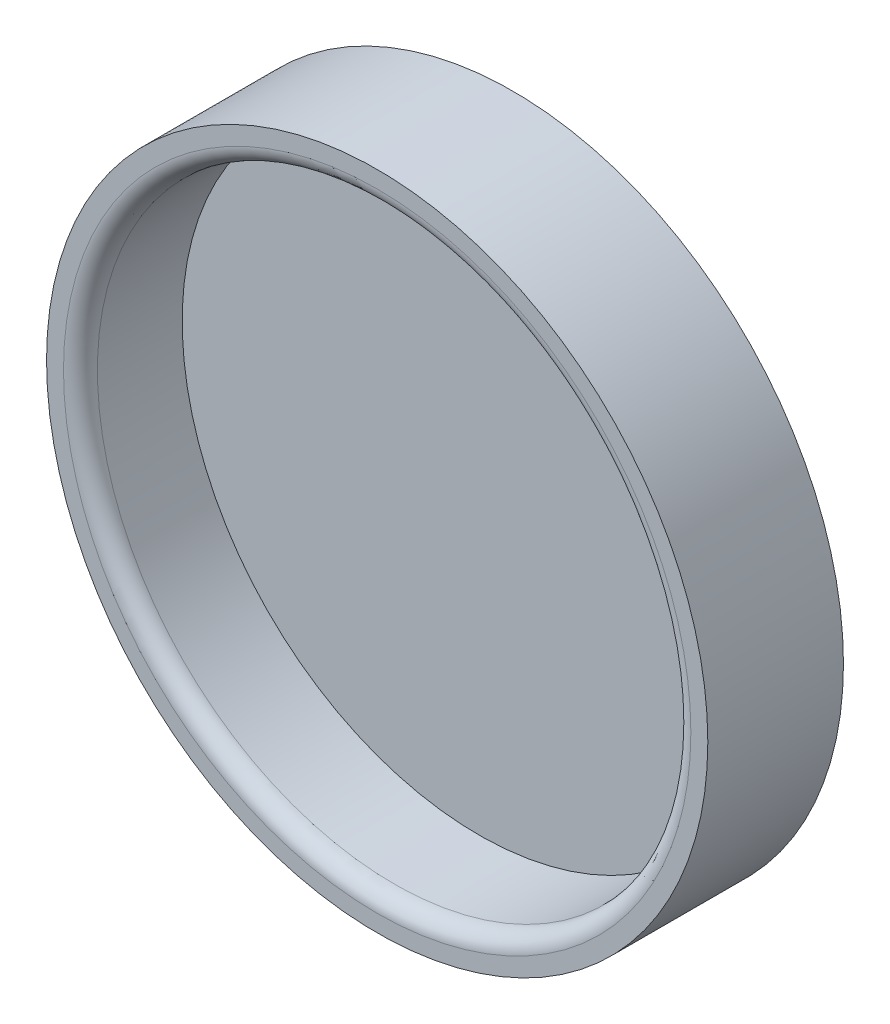
ISO-10303-21;
HEADER;
FILE_DESCRIPTION(('STEP AP214'),'2;1');
FILE_NAME('part.step','',(''),(''),'','','');
FILE_SCHEMA(('AUTOMOTIVE_DESIGN { 1 0 10303 214 1 1 1 1 }'));
ENDSEC;
DATA;
#1=APPLICATION_CONTEXT('core data for automotive mechanical design processes');
#2=APPLICATION_PROTOCOL_DEFINITION('international standard','automotive_design',2000,#1);
#3=PRODUCT_CONTEXT('',#1,'mechanical');
#4=PRODUCT('Part','Part','',(#3));
#5=PRODUCT_RELATED_PRODUCT_CATEGORY('part','',(#4));
#6=PRODUCT_DEFINITION_FORMATION('','',#4);
#7=PRODUCT_DEFINITION_CONTEXT('part definition',#1,'design');
#8=PRODUCT_DEFINITION('design','',#6,#7);
#9=PRODUCT_DEFINITION_SHAPE('','',#8);
#10=(LENGTH_UNIT() NAMED_UNIT(*) SI_UNIT(.MILLI.,.METRE.));
#11=(NAMED_UNIT(*) PLANE_ANGLE_UNIT() SI_UNIT($,.RADIAN.));
#12=(NAMED_UNIT(*) SI_UNIT($,.STERADIAN.) SOLID_ANGLE_UNIT());
#13=UNCERTAINTY_MEASURE_WITH_UNIT(LENGTH_MEASURE(1.E-05),#10,'distance_accuracy_value','');
#14=(GEOMETRIC_REPRESENTATION_CONTEXT(3) GLOBAL_UNCERTAINTY_ASSIGNED_CONTEXT((#13)) GLOBAL_UNIT_ASSIGNED_CONTEXT((#10,
#11,#12)) REPRESENTATION_CONTEXT('',''));
#15=CARTESIAN_POINT('',(0.,0.,0.));
#16=DIRECTION('',(0.,0.,1.));
#17=DIRECTION('',(1.,0.,0.));
#18=AXIS2_PLACEMENT_3D('',#15,#16,#17);
#19=CARTESIAN_POINT('',(0.,0.,1.));
#20=DIRECTION('',(0.,0.,-1.));
#21=DIRECTION('',(-1.,0.,0.));
#22=AXIS2_PLACEMENT_3D('',#19,#20,#21);
#23=CYLINDRICAL_SURFACE('',#22,9.75);
#24=CARTESIAN_POINT('',(0.,0.,0.));
#25=DIRECTION('',(0.,0.,1.));
#26=DIRECTION('',(1.,0.,0.));
#27=AXIS2_PLACEMENT_3D('',#24,#25,#26);
#28=CIRCLE('',#27,9.75);
#29=CARTESIAN_POINT('',(9.75,0.,0.));
#30=VERTEX_POINT('',#29);
#31=EDGE_CURVE('E61',#30,#30,#28,.T.);
#32=ORIENTED_EDGE('',*,*,#31,.T.);
#33=EDGE_LOOP('',(#32));
#34=FACE_BOUND('',#33,.T.);
#35=CARTESIAN_POINT('',(0.,0.,4.));
#36=DIRECTION('',(0.,0.,1.));
#37=DIRECTION('',(1.,0.,0.));
#38=AXIS2_PLACEMENT_3D('',#35,#36,#37);
#39=CIRCLE('',#38,9.75);
#40=CARTESIAN_POINT('',(9.75,0.,4.));
#41=VERTEX_POINT('',#40);
#42=EDGE_CURVE('E67',#41,#41,#39,.T.);
#43=ORIENTED_EDGE('',*,*,#42,.F.);
#44=EDGE_LOOP('',(#43));
#45=FACE_BOUND('',#44,.T.);
#46=ADVANCED_FACE('F43',(#34,#45),#23,.T.);
#47=CARTESIAN_POINT('',(0.,0.,0.));
#48=DIRECTION('',(0.,0.,1.));
#49=DIRECTION('',(1.,0.,0.));
#50=AXIS2_PLACEMENT_3D('',#47,#48,#49);
#51=PLANE('',#50);
#52=ORIENTED_EDGE('',*,*,#31,.F.);
#53=EDGE_LOOP('',(#52));
#54=FACE_BOUND('',#53,.T.);
#55=ADVANCED_FACE('F75',(#54),#51,.F.);
#56=CARTESIAN_POINT('',(0.,0.,4.));
#57=DIRECTION('',(0.,0.,1.));
#58=DIRECTION('',(1.,0.,0.));
#59=AXIS2_PLACEMENT_3D('',#56,#57,#58);
#60=PLANE('',#59);
#61=CARTESIAN_POINT('',(0.,0.,4.));
#62=DIRECTION('',(0.,0.,1.));
#63=DIRECTION('',(1.,0.,0.));
#64=AXIS2_PLACEMENT_3D('',#61,#62,#63);
#65=CIRCLE('',#64,9.25);
#66=CARTESIAN_POINT('',(9.25,0.,4.));
#67=VERTEX_POINT('',#66);
#68=EDGE_CURVE('E10',#67,#67,#65,.F.);
#69=ORIENTED_EDGE('',*,*,#68,.T.);
#70=EDGE_LOOP('',(#69));
#71=FACE_BOUND('',#70,.T.);
#72=ORIENTED_EDGE('',*,*,#42,.T.);
#73=EDGE_LOOP('',(#72));
#74=FACE_BOUND('',#73,.T.);
#75=ADVANCED_FACE('F72',(#71,#74),#60,.T.);
#76=CARTESIAN_POINT('',(0.,0.,4.));
#77=DIRECTION('',(0.,0.,-1.));
#78=DIRECTION('',(-1.,0.,0.));
#79=AXIS2_PLACEMENT_3D('',#76,#77,#78);
#80=CYLINDRICAL_SURFACE('',#79,8.75);
#81=CARTESIAN_POINT('',(0.,0.,3.5));
#82=DIRECTION('',(0.,0.,1.));
#83=DIRECTION('',(1.,0.,0.));
#84=AXIS2_PLACEMENT_3D('',#81,#82,#83);
#85=CIRCLE('',#84,8.75);
#86=CARTESIAN_POINT('',(8.75,0.,3.5));
#87=VERTEX_POINT('',#86);
#88=EDGE_CURVE('E51',#87,#87,#85,.T.);
#89=ORIENTED_EDGE('',*,*,#88,.T.);
#90=EDGE_LOOP('',(#89));
#91=FACE_BOUND('',#90,.T.);
#92=CARTESIAN_POINT('',(0.,0.,1.));
#93=DIRECTION('',(0.,0.,1.));
#94=DIRECTION('',(1.,0.,0.));
#95=AXIS2_PLACEMENT_3D('',#92,#93,#94);
#96=CIRCLE('',#95,8.75);
#97=CARTESIAN_POINT('',(8.75,0.,1.));
#98=VERTEX_POINT('',#97);
#99=EDGE_CURVE('E56',#98,#98,#96,.F.);
#100=ORIENTED_EDGE('',*,*,#99,.T.);
#101=EDGE_LOOP('',(#100));
#102=FACE_BOUND('',#101,.T.);
#103=ADVANCED_FACE('F86',(#91,#102),#80,.F.);
#104=CARTESIAN_POINT('',(0.,0.,1.));
#105=DIRECTION('',(0.,0.,1.));
#106=DIRECTION('',(1.,0.,0.));
#107=AXIS2_PLACEMENT_3D('',#104,#105,#106);
#108=PLANE('',#107);
#109=ORIENTED_EDGE('',*,*,#99,.F.);
#110=EDGE_LOOP('',(#109));
#111=FACE_BOUND('',#110,.T.);
#112=ADVANCED_FACE('F84',(#111),#108,.T.);
#113=CARTESIAN_POINT('',(0.,0.,3.5));
#114=DIRECTION('',(0.,0.,1.));
#115=DIRECTION('',(1.,0.,0.));
#116=AXIS2_PLACEMENT_3D('',#113,#114,#115);
#117=TOROIDAL_SURFACE('',#116,9.25,0.5);
#118=ORIENTED_EDGE('',*,*,#68,.F.);
#119=EDGE_LOOP('',(#118));
#120=FACE_BOUND('',#119,.T.);
#121=ORIENTED_EDGE('',*,*,#88,.F.);
#122=EDGE_LOOP('',(#121));
#123=FACE_BOUND('',#122,.T.);
#124=ADVANCED_FACE('F45',(#120,#123),#117,.T.);
#125=CLOSED_SHELL('',(#46,#55,#75,#103,#112,#124));
#126=MANIFOLD_SOLID_BREP('B2',#125);
#127=ADVANCED_BREP_SHAPE_REPRESENTATION('',(#18,#126),#14);
#128=SHAPE_DEFINITION_REPRESENTATION(#9,#127);
ENDSEC;
END-ISO-10303-21;
